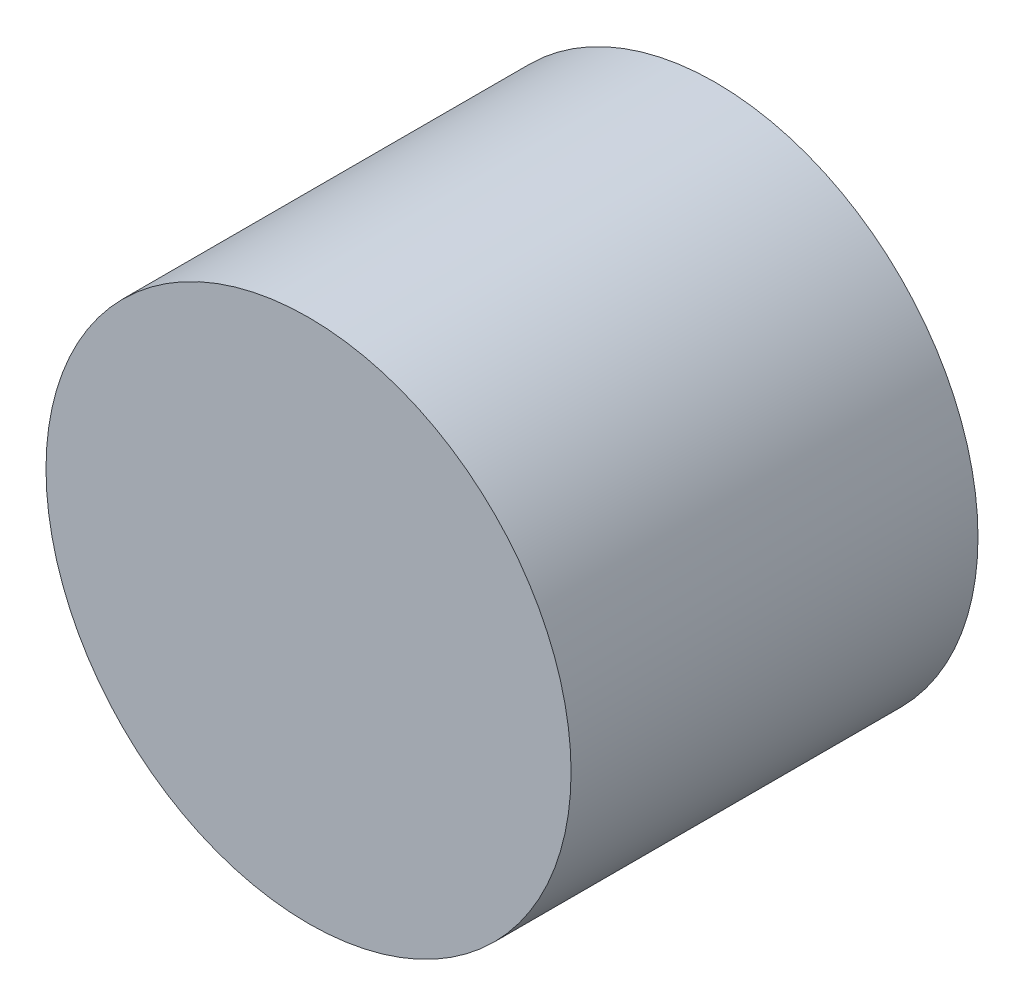
ISO-10303-21;
HEADER;
FILE_DESCRIPTION(('STEP AP214'),'2;1');
FILE_NAME('part.step','',(''),(''),'','','');
FILE_SCHEMA(('AUTOMOTIVE_DESIGN { 1 0 10303 214 1 1 1 1 }'));
ENDSEC;
DATA;
#1=APPLICATION_CONTEXT('core data for automotive mechanical design processes');
#2=APPLICATION_PROTOCOL_DEFINITION('international standard','automotive_design',2000,#1);
#3=PRODUCT_CONTEXT('',#1,'mechanical');
#4=PRODUCT('Part','Part','',(#3));
#5=PRODUCT_RELATED_PRODUCT_CATEGORY('part','',(#4));
#6=PRODUCT_DEFINITION_FORMATION('','',#4);
#7=PRODUCT_DEFINITION_CONTEXT('part definition',#1,'design');
#8=PRODUCT_DEFINITION('design','',#6,#7);
#9=PRODUCT_DEFINITION_SHAPE('','',#8);
#10=(LENGTH_UNIT() NAMED_UNIT(*) SI_UNIT(.MILLI.,.METRE.));
#11=(NAMED_UNIT(*) PLANE_ANGLE_UNIT() SI_UNIT($,.RADIAN.));
#12=(NAMED_UNIT(*) SI_UNIT($,.STERADIAN.) SOLID_ANGLE_UNIT());
#13=UNCERTAINTY_MEASURE_WITH_UNIT(LENGTH_MEASURE(1.E-05),#10,'distance_accuracy_value','');
#14=(GEOMETRIC_REPRESENTATION_CONTEXT(3) GLOBAL_UNCERTAINTY_ASSIGNED_CONTEXT((#13)) GLOBAL_UNIT_ASSIGNED_CONTEXT((#10,
#11,#12)) REPRESENTATION_CONTEXT('',''));
#15=CARTESIAN_POINT('',(0.,0.,0.));
#16=DIRECTION('',(0.,0.,1.));
#17=DIRECTION('',(1.,0.,0.));
#18=AXIS2_PLACEMENT_3D('',#15,#16,#17);
#19=CARTESIAN_POINT('',(0.,0.,0.));
#20=DIRECTION('',(0.,0.,1.));
#21=DIRECTION('',(1.,0.,0.));
#22=AXIS2_PLACEMENT_3D('',#19,#20,#21);
#23=PLANE('',#22);
#24=CARTESIAN_POINT('',(0.,0.,0.));
#25=DIRECTION('',(0.,0.,1.));
#26=DIRECTION('',(1.,0.,0.));
#27=AXIS2_PLACEMENT_3D('',#24,#25,#26);
#28=CIRCLE('',#27,60.);
#29=CARTESIAN_POINT('',(-60.,0.,0.));
#30=VERTEX_POINT('',#29);
#31=EDGE_CURVE('E10',#30,#30,#28,.T.);
#32=ORIENTED_EDGE('',*,*,#31,.F.);
#33=EDGE_LOOP('',(#32));
#34=FACE_BOUND('',#33,.T.);
#35=CARTESIAN_POINT('',(0.,0.,0.));
#36=DIRECTION('',(0.,0.,1.));
#37=DIRECTION('',(1.,0.,0.));
#38=AXIS2_PLACEMENT_3D('',#35,#36,#37);
#39=CIRCLE('',#38,57.);
#40=CARTESIAN_POINT('',(-57.,0.,0.));
#41=VERTEX_POINT('',#40);
#42=EDGE_CURVE('E45',#41,#41,#39,.T.);
#43=ORIENTED_EDGE('',*,*,#42,.T.);
#44=EDGE_LOOP('',(#43));
#45=FACE_BOUND('',#44,.T.);
#46=ADVANCED_FACE('F37',(#34,#45),#23,.F.);
#47=CARTESIAN_POINT('',(0.,0.,90.));
#48=DIRECTION('',(0.,0.,-1.));
#49=DIRECTION('',(-1.,0.,0.));
#50=AXIS2_PLACEMENT_3D('',#47,#48,#49);
#51=CYLINDRICAL_SURFACE('',#50,60.);
#52=CARTESIAN_POINT('',(0.,0.,93.));
#53=DIRECTION('',(0.,0.,1.));
#54=DIRECTION('',(1.,0.,0.));
#55=AXIS2_PLACEMENT_3D('',#52,#53,#54);
#56=CIRCLE('',#55,60.);
#57=CARTESIAN_POINT('',(-60.,0.,93.));
#58=VERTEX_POINT('',#57);
#59=EDGE_CURVE('E55',#58,#58,#56,.T.);
#60=CARTESIAN_POINT('',(-60.,0.,0.));
#61=CARTESIAN_POINT('',(-60.,0.,0.968749999999986));
#62=CARTESIAN_POINT('',(-60.,0.,1.93749999999999));
#63=CARTESIAN_POINT('',(-60.,0.,3.87499999999998));
#64=CARTESIAN_POINT('',(-60.,0.,4.84374999999998));
#65=CARTESIAN_POINT('',(-60.,0.,6.78124999999998));
#66=CARTESIAN_POINT('',(-60.,0.,7.74999999999998));
#67=CARTESIAN_POINT('',(-60.,0.,9.68749999999998));
#68=CARTESIAN_POINT('',(-60.,0.,10.65625));
#69=CARTESIAN_POINT('',(-60.,0.,12.59375));
#70=CARTESIAN_POINT('',(-60.,0.,13.5625));
#71=CARTESIAN_POINT('',(-60.,0.,15.5));
#72=CARTESIAN_POINT('',(-60.,0.,16.46875));
#73=CARTESIAN_POINT('',(-60.,0.,18.40625));
#74=CARTESIAN_POINT('',(-60.,0.,19.375));
#75=CARTESIAN_POINT('',(-60.,0.,21.3125));
#76=CARTESIAN_POINT('',(-60.,0.,22.28125));
#77=CARTESIAN_POINT('',(-60.,0.,24.21875));
#78=CARTESIAN_POINT('',(-60.,0.,25.1875));
#79=CARTESIAN_POINT('',(-60.,0.,27.125));
#80=CARTESIAN_POINT('',(-60.,0.,28.09375));
#81=CARTESIAN_POINT('',(-60.,0.,30.03125));
#82=CARTESIAN_POINT('',(-60.,0.,31.));
#83=CARTESIAN_POINT('',(-60.,0.,32.9375));
#84=CARTESIAN_POINT('',(-60.,0.,33.90625));
#85=CARTESIAN_POINT('',(-60.,0.,35.84375));
#86=CARTESIAN_POINT('',(-60.,0.,36.8125));
#87=CARTESIAN_POINT('',(-60.,0.,38.75));
#88=CARTESIAN_POINT('',(-60.,0.,39.71875));
#89=CARTESIAN_POINT('',(-60.,0.,41.65625));
#90=CARTESIAN_POINT('',(-60.,0.,42.625));
#91=CARTESIAN_POINT('',(-60.,0.,44.5625));
#92=CARTESIAN_POINT('',(-60.,0.,45.53125));
#93=CARTESIAN_POINT('',(-60.,0.,47.46875));
#94=CARTESIAN_POINT('',(-60.,0.,48.4375));
#95=CARTESIAN_POINT('',(-60.,0.,50.375));
#96=CARTESIAN_POINT('',(-60.,0.,51.34375));
#97=CARTESIAN_POINT('',(-60.,0.,53.28125));
#98=CARTESIAN_POINT('',(-60.,0.,54.25));
#99=CARTESIAN_POINT('',(-60.,0.,56.1875));
#100=CARTESIAN_POINT('',(-60.,0.,57.15625));
#101=CARTESIAN_POINT('',(-60.,0.,59.09375));
#102=CARTESIAN_POINT('',(-60.,0.,60.0625));
#103=CARTESIAN_POINT('',(-60.,0.,62.));
#104=CARTESIAN_POINT('',(-60.,0.,62.96875));
#105=CARTESIAN_POINT('',(-60.,0.,64.90625));
#106=CARTESIAN_POINT('',(-60.,0.,65.875));
#107=CARTESIAN_POINT('',(-60.,0.,67.8125));
#108=CARTESIAN_POINT('',(-60.,0.,68.78125));
#109=CARTESIAN_POINT('',(-60.,0.,70.71875));
#110=CARTESIAN_POINT('',(-60.,0.,71.6875));
#111=CARTESIAN_POINT('',(-60.,0.,73.625));
#112=CARTESIAN_POINT('',(-60.,0.,74.59375));
#113=CARTESIAN_POINT('',(-60.,0.,76.53125));
#114=CARTESIAN_POINT('',(-60.,0.,77.5));
#115=CARTESIAN_POINT('',(-60.,0.,79.4375));
#116=CARTESIAN_POINT('',(-60.,0.,80.40625));
#117=CARTESIAN_POINT('',(-60.,0.,82.34375));
#118=CARTESIAN_POINT('',(-60.,0.,83.3125));
#119=CARTESIAN_POINT('',(-60.,0.,85.25));
#120=CARTESIAN_POINT('',(-60.,0.,86.21875));
#121=CARTESIAN_POINT('',(-60.,0.,88.15625));
#122=CARTESIAN_POINT('',(-60.,0.,89.125));
#123=CARTESIAN_POINT('',(-60.,0.,91.0625));
#124=CARTESIAN_POINT('',(-60.,0.,92.03125));
#125=CARTESIAN_POINT('',(-60.,0.,93.));
#126=B_SPLINE_CURVE_WITH_KNOTS('',3,(#60,#61,#62,#63,#64,#65,#66,#67,#68,#69,#70,#71,#72,#73,
#74,#75,#76,#77,#78,#79,#80,#81,#82,#83,#84,#85,#86,#87,#88,#89,#90,#91,#92,#93,#94,#95,#96,#97,
#98,#99,#100,#101,#102,#103,#104,#105,#106,#107,#108,#109,#110,#111,#112,#113,#114,#115,#116,
#117,#118,#119,#120,#121,#122,#123,#124,#125),.UNSPECIFIED.,.F.,.F.,(4,2,2,2,2,2,2,2,2,2,2,2,2,
2,2,2,2,2,2,2,2,2,2,2,2,2,2,2,2,2,2,2,4),(0.,2.90625,5.8125,8.71875,11.625,14.53125,17.4375,
20.34375,23.25,26.15625,29.0625,31.96875,34.875,37.78125,40.6875,43.59375,46.5,49.40625,52.3125,
55.21875,58.125,61.03125,63.9375,66.84375,69.75,72.65625,75.5625,78.46875,81.375,84.28125,
87.1875,90.09375,93.),.UNSPECIFIED.);
#127=EDGE_CURVE('BSEAM39',#30,#58,#126,.T.);
#128=ORIENTED_EDGE('',*,*,#31,.T.);
#129=ORIENTED_EDGE('',*,*,#59,.F.);
#130=ORIENTED_EDGE('',*,*,#127,.T.);
#131=ORIENTED_EDGE('',*,*,#127,.F.);
#132=EDGE_LOOP('',(#128,#130,#129,#131));
#133=FACE_BOUND('',#132,.T.);
#134=ADVANCED_FACE('F39',(#133),#51,.T.);
#135=CARTESIAN_POINT('',(0.,0.,90.));
#136=DIRECTION('',(0.,0.,-1.));
#137=DIRECTION('',(-1.,0.,0.));
#138=AXIS2_PLACEMENT_3D('',#135,#136,#137);
#139=CYLINDRICAL_SURFACE('',#138,57.);
#140=CARTESIAN_POINT('',(0.,0.,90.));
#141=DIRECTION('',(0.,0.,1.));
#142=DIRECTION('',(1.,0.,0.));
#143=AXIS2_PLACEMENT_3D('',#140,#141,#142);
#144=CIRCLE('',#143,57.);
#145=CARTESIAN_POINT('',(-57.,0.,90.));
#146=VERTEX_POINT('',#145);
#147=EDGE_CURVE('E50',#146,#146,#144,.T.);
#148=CARTESIAN_POINT('',(-57.,0.,90.));
#149=CARTESIAN_POINT('',(-57.,0.,89.0625));
#150=CARTESIAN_POINT('',(-57.,0.,88.125));
#151=CARTESIAN_POINT('',(-57.,0.,86.25));
#152=CARTESIAN_POINT('',(-57.,0.,85.3125));
#153=CARTESIAN_POINT('',(-57.,0.,83.4375));
#154=CARTESIAN_POINT('',(-57.,0.,82.5));
#155=CARTESIAN_POINT('',(-57.,0.,80.625));
#156=CARTESIAN_POINT('',(-57.,0.,79.6875));
#157=CARTESIAN_POINT('',(-57.,0.,77.8125));
#158=CARTESIAN_POINT('',(-57.,0.,76.875));
#159=CARTESIAN_POINT('',(-57.,0.,75.));
#160=CARTESIAN_POINT('',(-57.,0.,74.0625));
#161=CARTESIAN_POINT('',(-57.,0.,72.1875));
#162=CARTESIAN_POINT('',(-57.,0.,71.25));
#163=CARTESIAN_POINT('',(-57.,0.,69.375));
#164=CARTESIAN_POINT('',(-57.,0.,68.4375));
#165=CARTESIAN_POINT('',(-57.,0.,66.5625));
#166=CARTESIAN_POINT('',(-57.,0.,65.625));
#167=CARTESIAN_POINT('',(-57.,0.,63.75));
#168=CARTESIAN_POINT('',(-57.,0.,62.8125));
#169=CARTESIAN_POINT('',(-57.,0.,60.9375));
#170=CARTESIAN_POINT('',(-57.,0.,60.));
#171=CARTESIAN_POINT('',(-57.,0.,58.125));
#172=CARTESIAN_POINT('',(-57.,0.,57.1875));
#173=CARTESIAN_POINT('',(-57.,0.,55.3125));
#174=CARTESIAN_POINT('',(-57.,0.,54.375));
#175=CARTESIAN_POINT('',(-57.,0.,52.5));
#176=CARTESIAN_POINT('',(-57.,0.,51.5625));
#177=CARTESIAN_POINT('',(-57.,0.,49.6875));
#178=CARTESIAN_POINT('',(-57.,0.,48.75));
#179=CARTESIAN_POINT('',(-57.,0.,46.875));
#180=CARTESIAN_POINT('',(-57.,0.,45.9375));
#181=CARTESIAN_POINT('',(-57.,0.,44.0625));
#182=CARTESIAN_POINT('',(-57.,0.,43.125));
#183=CARTESIAN_POINT('',(-57.,0.,41.25));
#184=CARTESIAN_POINT('',(-57.,0.,40.3125));
#185=CARTESIAN_POINT('',(-57.,0.,38.4375));
#186=CARTESIAN_POINT('',(-57.,0.,37.5));
#187=CARTESIAN_POINT('',(-57.,0.,35.625));
#188=CARTESIAN_POINT('',(-57.,0.,34.6875));
#189=CARTESIAN_POINT('',(-57.,0.,32.8125));
#190=CARTESIAN_POINT('',(-57.,0.,31.875));
#191=CARTESIAN_POINT('',(-57.,0.,30.));
#192=CARTESIAN_POINT('',(-57.,0.,29.0625));
#193=CARTESIAN_POINT('',(-57.,0.,27.1875));
#194=CARTESIAN_POINT('',(-57.,0.,26.25));
#195=CARTESIAN_POINT('',(-57.,0.,24.375));
#196=CARTESIAN_POINT('',(-57.,0.,23.4375));
#197=CARTESIAN_POINT('',(-57.,0.,21.5625));
#198=CARTESIAN_POINT('',(-57.,0.,20.625));
#199=CARTESIAN_POINT('',(-57.,0.,18.75));
#200=CARTESIAN_POINT('',(-57.,0.,17.8125));
#201=CARTESIAN_POINT('',(-57.,0.,15.9375));
#202=CARTESIAN_POINT('',(-57.,0.,15.));
#203=CARTESIAN_POINT('',(-57.,0.,13.125));
#204=CARTESIAN_POINT('',(-57.,0.,12.1875));
#205=CARTESIAN_POINT('',(-57.,0.,10.3125));
#206=CARTESIAN_POINT('',(-57.,0.,9.37499999999999));
#207=CARTESIAN_POINT('',(-57.,0.,7.49999999999999));
#208=CARTESIAN_POINT('',(-57.,0.,6.56249999999999));
#209=CARTESIAN_POINT('',(-57.,0.,4.68749999999999));
#210=CARTESIAN_POINT('',(-57.,0.,3.74999999999998));
#211=CARTESIAN_POINT('',(-57.,0.,1.87499999999998));
#212=CARTESIAN_POINT('',(-57.,0.,0.937499999999986));
#213=CARTESIAN_POINT('',(-57.,0.,0.));
#214=B_SPLINE_CURVE_WITH_KNOTS('',3,(#148,#149,#150,#151,#152,#153,#154,#155,#156,#157,#158,
#159,#160,#161,#162,#163,#164,#165,#166,#167,#168,#169,#170,#171,#172,#173,#174,#175,#176,#177,
#178,#179,#180,#181,#182,#183,#184,#185,#186,#187,#188,#189,#190,#191,#192,#193,#194,#195,#196,
#197,#198,#199,#200,#201,#202,#203,#204,#205,#206,#207,#208,#209,#210,#211,#212,#213),
.UNSPECIFIED.,.F.,.F.,(4,2,2,2,2,2,2,2,2,2,2,2,2,2,2,2,2,2,2,2,2,2,2,2,2,2,2,2,2,2,2,2,4),(0.,
2.81250000000001,5.62500000000001,8.43750000000001,11.25,14.0625,16.875,19.6875,22.5,25.3125,
28.125,30.9375,33.75,36.5625,39.375,42.1875,45.,47.8125,50.625,53.4375,56.25,59.0625,61.875,
64.6875,67.5,70.3125,73.125,75.9375,78.75,81.5625,84.375,87.1875,90.),.UNSPECIFIED.);
#215=EDGE_CURVE('BSEAM65',#146,#41,#214,.T.);
#216=ORIENTED_EDGE('',*,*,#147,.T.);
#217=ORIENTED_EDGE('',*,*,#42,.F.);
#218=ORIENTED_EDGE('',*,*,#215,.T.);
#219=ORIENTED_EDGE('',*,*,#215,.F.);
#220=EDGE_LOOP('',(#216,#218,#217,#219));
#221=FACE_BOUND('',#220,.T.);
#222=ADVANCED_FACE('F65',(#221),#139,.F.);
#223=CARTESIAN_POINT('',(0.,0.,90.));
#224=DIRECTION('',(0.,0.,1.));
#225=DIRECTION('',(1.,0.,0.));
#226=AXIS2_PLACEMENT_3D('',#223,#224,#225);
#227=PLANE('',#226);
#228=ORIENTED_EDGE('',*,*,#147,.F.);
#229=EDGE_LOOP('',(#228));
#230=FACE_BOUND('',#229,.T.);
#231=ADVANCED_FACE('F70',(#230),#227,.F.);
#232=CARTESIAN_POINT('',(0.,0.,93.));
#233=DIRECTION('',(0.,0.,1.));
#234=DIRECTION('',(1.,0.,0.));
#235=AXIS2_PLACEMENT_3D('',#232,#233,#234);
#236=PLANE('',#235);
#237=ORIENTED_EDGE('',*,*,#59,.T.);
#238=EDGE_LOOP('',(#237));
#239=FACE_BOUND('',#238,.T.);
#240=ADVANCED_FACE('F62',(#239),#236,.T.);
#241=CLOSED_SHELL('',(#46,#134,#222,#231,#240));
#242=MANIFOLD_SOLID_BREP('B2',#241);
#243=ADVANCED_BREP_SHAPE_REPRESENTATION('',(#18,#242),#14);
#244=SHAPE_DEFINITION_REPRESENTATION(#9,#243);
ENDSEC;
END-ISO-10303-21;
